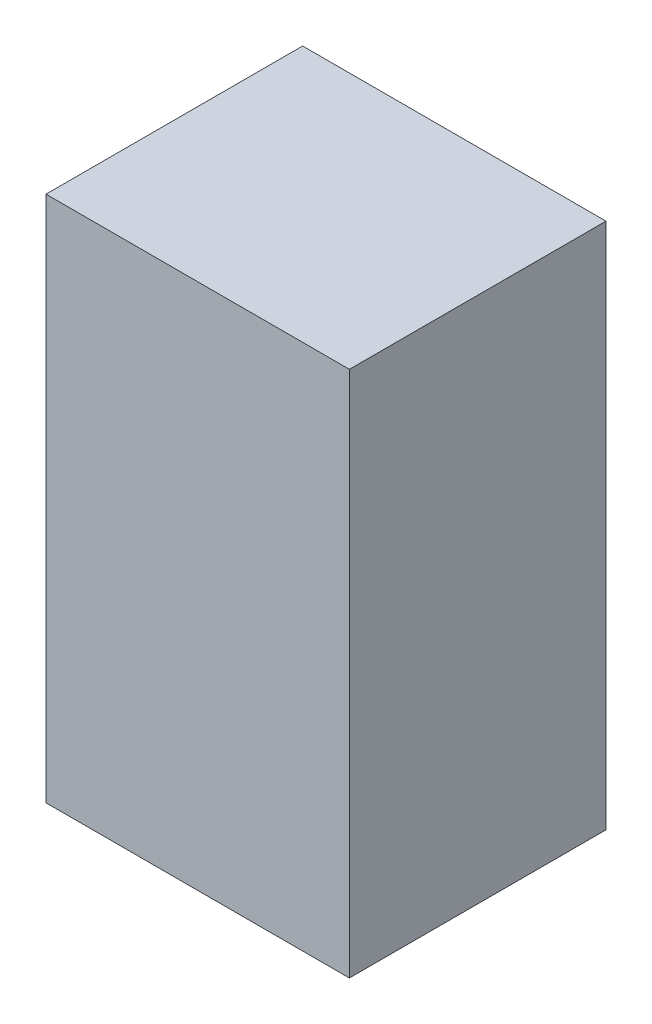
ISO-10303-21;
HEADER;
FILE_DESCRIPTION(('STEP AP214'),'2;1');
FILE_NAME('part.step','',(''),(''),'','','');
FILE_SCHEMA(('AUTOMOTIVE_DESIGN { 1 0 10303 214 1 1 1 1 }'));
ENDSEC;
DATA;
#1=APPLICATION_CONTEXT('core data for automotive mechanical design processes');
#2=APPLICATION_PROTOCOL_DEFINITION('international standard','automotive_design',2000,#1);
#3=PRODUCT_CONTEXT('',#1,'mechanical');
#4=PRODUCT('Part','Part','',(#3));
#5=PRODUCT_RELATED_PRODUCT_CATEGORY('part','',(#4));
#6=PRODUCT_DEFINITION_FORMATION('','',#4);
#7=PRODUCT_DEFINITION_CONTEXT('part definition',#1,'design');
#8=PRODUCT_DEFINITION('design','',#6,#7);
#9=PRODUCT_DEFINITION_SHAPE('','',#8);
#10=(LENGTH_UNIT() NAMED_UNIT(*) SI_UNIT(.MILLI.,.METRE.));
#11=(NAMED_UNIT(*) PLANE_ANGLE_UNIT() SI_UNIT($,.RADIAN.));
#12=(NAMED_UNIT(*) SI_UNIT($,.STERADIAN.) SOLID_ANGLE_UNIT());
#13=UNCERTAINTY_MEASURE_WITH_UNIT(LENGTH_MEASURE(1.E-05),#10,'distance_accuracy_value','');
#14=(GEOMETRIC_REPRESENTATION_CONTEXT(3) GLOBAL_UNCERTAINTY_ASSIGNED_CONTEXT((#13)) GLOBAL_UNIT_ASSIGNED_CONTEXT((#10,
#11,#12)) REPRESENTATION_CONTEXT('',''));
#15=CARTESIAN_POINT('',(0.,0.,0.));
#16=DIRECTION('',(0.,0.,1.));
#17=DIRECTION('',(1.,0.,0.));
#18=AXIS2_PLACEMENT_3D('',#15,#16,#17);
#19=CARTESIAN_POINT('',(-15.25,-26.5,25.8));
#20=DIRECTION('',(0.,0.,1.));
#21=DIRECTION('',(1.,0.,0.));
#22=AXIS2_PLACEMENT_3D('',#19,#20,#21);
#23=PLANE('',#22);
#24=DIRECTION('',(0.,1.,0.));
#25=VECTOR('',#24,1.);
#26=CARTESIAN_POINT('',(-15.25,-26.5,25.8));
#27=LINE('',#26,#25);
#28=CARTESIAN_POINT('',(-15.25,-26.5,25.8));
#29=VERTEX_POINT('',#28);
#30=CARTESIAN_POINT('',(-15.25,26.5,25.8));
#31=VERTEX_POINT('',#30);
#32=EDGE_CURVE('E70',#29,#31,#27,.T.);
#33=ORIENTED_EDGE('',*,*,#32,.F.);
#34=DIRECTION('',(1.,0.,0.));
#35=VECTOR('',#34,1.);
#36=CARTESIAN_POINT('',(-15.25,-26.5,25.8));
#37=LINE('',#36,#35);
#38=CARTESIAN_POINT('',(15.25,-26.5,25.8));
#39=VERTEX_POINT('',#38);
#40=EDGE_CURVE('E65',#29,#39,#37,.T.);
#41=ORIENTED_EDGE('',*,*,#40,.T.);
#42=DIRECTION('',(0.,1.,0.));
#43=VECTOR('',#42,1.);
#44=CARTESIAN_POINT('',(15.25,-26.5,25.8));
#45=LINE('',#44,#43);
#46=CARTESIAN_POINT('',(15.25,26.5,25.8));
#47=VERTEX_POINT('',#46);
#48=EDGE_CURVE('E67',#39,#47,#45,.T.);
#49=ORIENTED_EDGE('',*,*,#48,.T.);
#50=DIRECTION('',(1.,0.,0.));
#51=VECTOR('',#50,1.);
#52=CARTESIAN_POINT('',(-15.25,26.5,25.8));
#53=LINE('',#52,#51);
#54=EDGE_CURVE('E10',#31,#47,#53,.T.);
#55=ORIENTED_EDGE('',*,*,#54,.F.);
#56=EDGE_LOOP('',(#33,#41,#49,#55));
#57=FACE_BOUND('',#56,.T.);
#58=ADVANCED_FACE('F16',(#57),#23,.T.);
#59=CARTESIAN_POINT('',(-15.25,-26.5,0.));
#60=DIRECTION('',(0.,0.,1.));
#61=DIRECTION('',(1.,0.,0.));
#62=AXIS2_PLACEMENT_3D('',#59,#60,#61);
#63=PLANE('',#62);
#64=DIRECTION('',(1.,0.,0.));
#65=VECTOR('',#64,1.);
#66=CARTESIAN_POINT('',(-15.25,26.5,0.));
#67=LINE('',#66,#65);
#68=CARTESIAN_POINT('',(-15.25,26.5,0.));
#69=VERTEX_POINT('',#68);
#70=CARTESIAN_POINT('',(15.25,26.5,0.));
#71=VERTEX_POINT('',#70);
#72=EDGE_CURVE('E26',#69,#71,#67,.T.);
#73=ORIENTED_EDGE('',*,*,#72,.T.);
#74=DIRECTION('',(0.,1.,0.));
#75=VECTOR('',#74,1.);
#76=CARTESIAN_POINT('',(15.25,-26.5,0.));
#77=LINE('',#76,#75);
#78=CARTESIAN_POINT('',(15.25,-26.5,0.));
#79=VERTEX_POINT('',#78);
#80=EDGE_CURVE('E87',#79,#71,#77,.T.);
#81=ORIENTED_EDGE('',*,*,#80,.F.);
#82=DIRECTION('',(1.,0.,0.));
#83=VECTOR('',#82,1.);
#84=CARTESIAN_POINT('',(-15.25,-26.5,0.));
#85=LINE('',#84,#83);
#86=CARTESIAN_POINT('',(-15.25,-26.5,0.));
#87=VERTEX_POINT('',#86);
#88=EDGE_CURVE('E19',#87,#79,#85,.T.);
#89=ORIENTED_EDGE('',*,*,#88,.F.);
#90=DIRECTION('',(0.,1.,0.));
#91=VECTOR('',#90,1.);
#92=CARTESIAN_POINT('',(-15.25,-26.5,0.));
#93=LINE('',#92,#91);
#94=EDGE_CURVE('E95',#87,#69,#93,.T.);
#95=ORIENTED_EDGE('',*,*,#94,.T.);
#96=EDGE_LOOP('',(#73,#81,#89,#95));
#97=FACE_BOUND('',#96,.T.);
#98=ADVANCED_FACE('F134',(#97),#63,.F.);
#99=CARTESIAN_POINT('',(-15.25,26.5,0.));
#100=DIRECTION('',(0.,1.,0.));
#101=DIRECTION('',(1.,0.,0.));
#102=AXIS2_PLACEMENT_3D('',#99,#100,#101);
#103=PLANE('',#102);
#104=ORIENTED_EDGE('',*,*,#72,.F.);
#105=DIRECTION('',(0.,0.,1.));
#106=VECTOR('',#105,1.);
#107=CARTESIAN_POINT('',(-15.25,26.5,0.));
#108=LINE('',#107,#106);
#109=EDGE_CURVE('E172',#69,#31,#108,.T.);
#110=ORIENTED_EDGE('',*,*,#109,.T.);
#111=ORIENTED_EDGE('',*,*,#54,.T.);
#112=DIRECTION('',(0.,0.,1.));
#113=VECTOR('',#112,1.);
#114=CARTESIAN_POINT('',(15.25,26.5,0.));
#115=LINE('',#114,#113);
#116=EDGE_CURVE('E81',#71,#47,#115,.T.);
#117=ORIENTED_EDGE('',*,*,#116,.F.);
#118=EDGE_LOOP('',(#104,#110,#111,#117));
#119=FACE_BOUND('',#118,.T.);
#120=ADVANCED_FACE('F112',(#119),#103,.T.);
#121=CARTESIAN_POINT('',(-15.25,-26.5,0.));
#122=DIRECTION('',(0.,1.,0.));
#123=DIRECTION('',(1.,0.,0.));
#124=AXIS2_PLACEMENT_3D('',#121,#122,#123);
#125=PLANE('',#124);
#126=DIRECTION('',(0.,0.,1.));
#127=VECTOR('',#126,1.);
#128=CARTESIAN_POINT('',(15.25,-26.5,0.));
#129=LINE('',#128,#127);
#130=EDGE_CURVE('E80',#79,#39,#129,.T.);
#131=ORIENTED_EDGE('',*,*,#130,.T.);
#132=ORIENTED_EDGE('',*,*,#40,.F.);
#133=DIRECTION('',(0.,0.,1.));
#134=VECTOR('',#133,1.);
#135=CARTESIAN_POINT('',(-15.25,-26.5,0.));
#136=LINE('',#135,#134);
#137=EDGE_CURVE('E88',#87,#29,#136,.T.);
#138=ORIENTED_EDGE('',*,*,#137,.F.);
#139=ORIENTED_EDGE('',*,*,#88,.T.);
#140=EDGE_LOOP('',(#131,#132,#138,#139));
#141=FACE_BOUND('',#140,.T.);
#142=ADVANCED_FACE('F84',(#141),#125,.F.);
#143=CARTESIAN_POINT('',(15.25,-26.5,0.));
#144=DIRECTION('',(1.,0.,0.));
#145=DIRECTION('',(0.,1.,0.));
#146=AXIS2_PLACEMENT_3D('',#143,#144,#145);
#147=PLANE('',#146);
#148=ORIENTED_EDGE('',*,*,#130,.F.);
#149=ORIENTED_EDGE('',*,*,#80,.T.);
#150=ORIENTED_EDGE('',*,*,#116,.T.);
#151=ORIENTED_EDGE('',*,*,#48,.F.);
#152=EDGE_LOOP('',(#148,#149,#150,#151));
#153=FACE_BOUND('',#152,.T.);
#154=ADVANCED_FACE('F78',(#153),#147,.T.);
#155=CARTESIAN_POINT('',(-15.25,-26.5,0.));
#156=DIRECTION('',(1.,0.,0.));
#157=DIRECTION('',(0.,1.,0.));
#158=AXIS2_PLACEMENT_3D('',#155,#156,#157);
#159=PLANE('',#158);
#160=ORIENTED_EDGE('',*,*,#32,.T.);
#161=ORIENTED_EDGE('',*,*,#109,.F.);
#162=ORIENTED_EDGE('',*,*,#94,.F.);
#163=ORIENTED_EDGE('',*,*,#137,.T.);
#164=EDGE_LOOP('',(#160,#161,#162,#163));
#165=FACE_BOUND('',#164,.T.);
#166=ADVANCED_FACE('F117',(#165),#159,.F.);
#167=CLOSED_SHELL('',(#58,#98,#120,#142,#154,#166));
#168=MANIFOLD_SOLID_BREP('B1',#167);
#169=ADVANCED_BREP_SHAPE_REPRESENTATION('',(#18,#168),#14);
#170=SHAPE_DEFINITION_REPRESENTATION(#9,#169);
ENDSEC;
END-ISO-10303-21;
